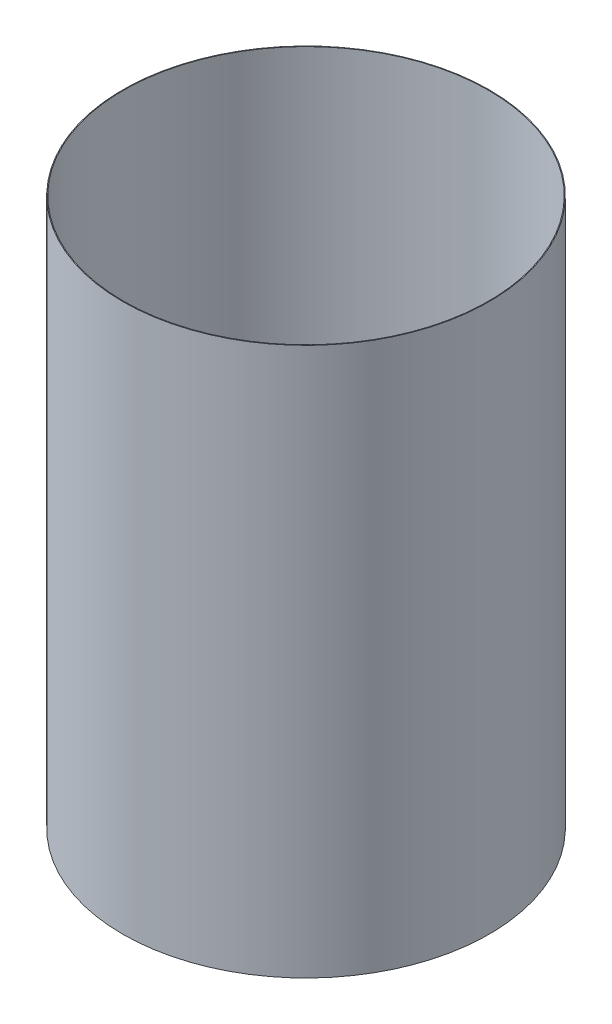
ISO-10303-21;
HEADER;
FILE_DESCRIPTION(('STEP AP214'),'2;1');
FILE_NAME('part.step','',(''),(''),'','','');
FILE_SCHEMA(('AUTOMOTIVE_DESIGN { 1 0 10303 214 1 1 1 1 }'));
ENDSEC;
DATA;
#1=APPLICATION_CONTEXT('core data for automotive mechanical design processes');
#2=APPLICATION_PROTOCOL_DEFINITION('international standard','automotive_design',2000,#1);
#3=PRODUCT_CONTEXT('',#1,'mechanical');
#4=PRODUCT('Part','Part','',(#3));
#5=PRODUCT_RELATED_PRODUCT_CATEGORY('part','',(#4));
#6=PRODUCT_DEFINITION_FORMATION('','',#4);
#7=PRODUCT_DEFINITION_CONTEXT('part definition',#1,'design');
#8=PRODUCT_DEFINITION('design','',#6,#7);
#9=PRODUCT_DEFINITION_SHAPE('','',#8);
#10=(LENGTH_UNIT() NAMED_UNIT(*) SI_UNIT(.MILLI.,.METRE.));
#11=(NAMED_UNIT(*) PLANE_ANGLE_UNIT() SI_UNIT($,.RADIAN.));
#12=(NAMED_UNIT(*) SI_UNIT($,.STERADIAN.) SOLID_ANGLE_UNIT());
#13=UNCERTAINTY_MEASURE_WITH_UNIT(LENGTH_MEASURE(1.E-05),#10,'distance_accuracy_value','');
#14=(GEOMETRIC_REPRESENTATION_CONTEXT(3) GLOBAL_UNCERTAINTY_ASSIGNED_CONTEXT((#13)) GLOBAL_UNIT_ASSIGNED_CONTEXT((#10,
#11,#12)) REPRESENTATION_CONTEXT('',''));
#15=CARTESIAN_POINT('',(0.,0.,0.));
#16=DIRECTION('',(0.,0.,1.));
#17=DIRECTION('',(1.,0.,0.));
#18=AXIS2_PLACEMENT_3D('',#15,#16,#17);
#19=CARTESIAN_POINT('',(0.,3300.,0.));
#20=DIRECTION('',(0.,1.,0.));
#21=DIRECTION('',(0.,0.,1.));
#22=AXIS2_PLACEMENT_3D('',#19,#20,#21);
#23=PLANE('',#22);
#24=CARTESIAN_POINT('',(0.,3300.,0.));
#25=DIRECTION('',(0.,1.,0.));
#26=DIRECTION('',(0.,0.,1.));
#27=AXIS2_PLACEMENT_3D('',#24,#25,#26);
#28=CIRCLE('',#27,502.);
#29=CARTESIAN_POINT('',(0.,3300.,502.));
#30=VERTEX_POINT('',#29);
#31=EDGE_CURVE('E10',#30,#30,#28,.T.);
#32=ORIENTED_EDGE('',*,*,#31,.T.);
#33=EDGE_LOOP('',(#32));
#34=FACE_BOUND('',#33,.T.);
#35=CARTESIAN_POINT('',(0.,3300.,0.));
#36=DIRECTION('',(0.,1.,0.));
#37=DIRECTION('',(0.,0.,1.));
#38=AXIS2_PLACEMENT_3D('',#35,#36,#37);
#39=CIRCLE('',#38,500.);
#40=CARTESIAN_POINT('',(0.,3300.,500.));
#41=VERTEX_POINT('',#40);
#42=EDGE_CURVE('E46',#41,#41,#39,.T.);
#43=ORIENTED_EDGE('',*,*,#42,.F.);
#44=EDGE_LOOP('',(#43));
#45=FACE_BOUND('',#44,.T.);
#46=ADVANCED_FACE('F35',(#34,#45),#23,.T.);
#47=CARTESIAN_POINT('',(0.,1800.,0.));
#48=DIRECTION('',(0.,1.,0.));
#49=DIRECTION('',(0.,0.,1.));
#50=AXIS2_PLACEMENT_3D('',#47,#48,#49);
#51=PLANE('',#50);
#52=CARTESIAN_POINT('',(0.,1800.,0.));
#53=DIRECTION('',(0.,1.,0.));
#54=DIRECTION('',(0.,0.,1.));
#55=AXIS2_PLACEMENT_3D('',#52,#53,#54);
#56=CIRCLE('',#55,502.);
#57=CARTESIAN_POINT('',(0.,1800.,502.));
#58=VERTEX_POINT('',#57);
#59=EDGE_CURVE('E39',#58,#58,#56,.T.);
#60=ORIENTED_EDGE('',*,*,#59,.F.);
#61=EDGE_LOOP('',(#60));
#62=FACE_BOUND('',#61,.T.);
#63=CARTESIAN_POINT('',(0.,1800.,0.));
#64=DIRECTION('',(0.,1.,0.));
#65=DIRECTION('',(0.,0.,1.));
#66=AXIS2_PLACEMENT_3D('',#63,#64,#65);
#67=CIRCLE('',#66,500.);
#68=CARTESIAN_POINT('',(0.,1800.,500.));
#69=VERTEX_POINT('',#68);
#70=EDGE_CURVE('E48',#69,#69,#67,.T.);
#71=ORIENTED_EDGE('',*,*,#70,.T.);
#72=EDGE_LOOP('',(#71));
#73=FACE_BOUND('',#72,.T.);
#74=ADVANCED_FACE('F58',(#62,#73),#51,.F.);
#75=CARTESIAN_POINT('',(0.,3300.,0.));
#76=DIRECTION('',(0.,-1.,0.));
#77=DIRECTION('',(0.,0.,-1.));
#78=AXIS2_PLACEMENT_3D('',#75,#76,#77);
#79=CYLINDRICAL_SURFACE('',#78,502.);
#80=ORIENTED_EDGE('',*,*,#31,.F.);
#81=EDGE_LOOP('',(#80));
#82=FACE_BOUND('',#81,.T.);
#83=ORIENTED_EDGE('',*,*,#59,.T.);
#84=EDGE_LOOP('',(#83));
#85=FACE_BOUND('',#84,.T.);
#86=ADVANCED_FACE('F37',(#82,#85),#79,.T.);
#87=CARTESIAN_POINT('',(0.,3300.,0.));
#88=DIRECTION('',(0.,-1.,0.));
#89=DIRECTION('',(0.,0.,-1.));
#90=AXIS2_PLACEMENT_3D('',#87,#88,#89);
#91=CYLINDRICAL_SURFACE('',#90,500.);
#92=ORIENTED_EDGE('',*,*,#42,.T.);
#93=EDGE_LOOP('',(#92));
#94=FACE_BOUND('',#93,.T.);
#95=ORIENTED_EDGE('',*,*,#70,.F.);
#96=EDGE_LOOP('',(#95));
#97=FACE_BOUND('',#96,.T.);
#98=ADVANCED_FACE('F54',(#94,#97),#91,.F.);
#99=CLOSED_SHELL('',(#46,#74,#86,#98));
#100=MANIFOLD_SOLID_BREP('B2',#99);
#101=ADVANCED_BREP_SHAPE_REPRESENTATION('',(#18,#100),#14);
#102=SHAPE_DEFINITION_REPRESENTATION(#9,#101);
ENDSEC;
END-ISO-10303-21;
